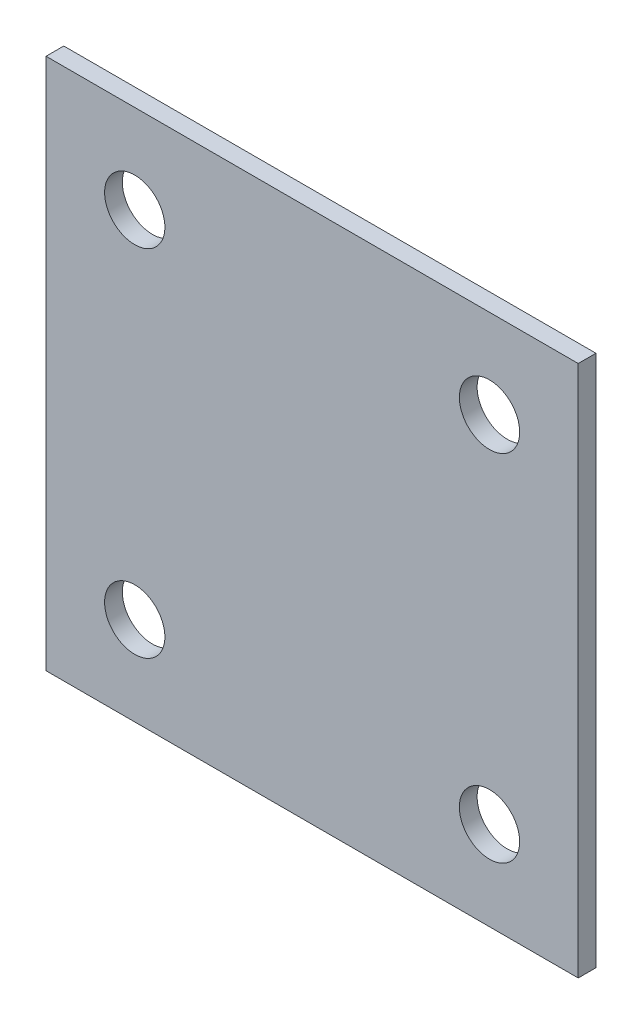
ISO-10303-21;
HEADER;
FILE_DESCRIPTION(('STEP AP214'),'2;1');
FILE_NAME('part.step','',(''),(''),'','','');
FILE_SCHEMA(('AUTOMOTIVE_DESIGN { 1 0 10303 214 1 1 1 1 }'));
ENDSEC;
DATA;
#1=APPLICATION_CONTEXT('core data for automotive mechanical design processes');
#2=APPLICATION_PROTOCOL_DEFINITION('international standard','automotive_design',2000,#1);
#3=PRODUCT_CONTEXT('',#1,'mechanical');
#4=PRODUCT('Part','Part','',(#3));
#5=PRODUCT_RELATED_PRODUCT_CATEGORY('part','',(#4));
#6=PRODUCT_DEFINITION_FORMATION('','',#4);
#7=PRODUCT_DEFINITION_CONTEXT('part definition',#1,'design');
#8=PRODUCT_DEFINITION('design','',#6,#7);
#9=PRODUCT_DEFINITION_SHAPE('','',#8);
#10=(LENGTH_UNIT() NAMED_UNIT(*) SI_UNIT(.MILLI.,.METRE.));
#11=(NAMED_UNIT(*) PLANE_ANGLE_UNIT() SI_UNIT($,.RADIAN.));
#12=(NAMED_UNIT(*) SI_UNIT($,.STERADIAN.) SOLID_ANGLE_UNIT());
#13=UNCERTAINTY_MEASURE_WITH_UNIT(LENGTH_MEASURE(1.E-05),#10,'distance_accuracy_value','');
#14=(GEOMETRIC_REPRESENTATION_CONTEXT(3) GLOBAL_UNCERTAINTY_ASSIGNED_CONTEXT((#13)) GLOBAL_UNIT_ASSIGNED_CONTEXT((#10,
#11,#12)) REPRESENTATION_CONTEXT('',''));
#15=CARTESIAN_POINT('',(0.,0.,0.));
#16=DIRECTION('',(0.,0.,1.));
#17=DIRECTION('',(1.,0.,0.));
#18=AXIS2_PLACEMENT_3D('',#15,#16,#17);
#19=CARTESIAN_POINT('',(-15.,-15.,1.));
#20=DIRECTION('',(1.,0.,0.));
#21=DIRECTION('',(0.,0.,-1.));
#22=AXIS2_PLACEMENT_3D('',#19,#20,#21);
#23=PLANE('',#22);
#24=DIRECTION('',(0.,-1.,0.));
#25=VECTOR('',#24,1.);
#26=CARTESIAN_POINT('',(-15.,-15.,0.));
#27=LINE('',#26,#25);
#28=CARTESIAN_POINT('',(-15.,15.,0.));
#29=VERTEX_POINT('',#28);
#30=CARTESIAN_POINT('',(-15.,-15.,0.));
#31=VERTEX_POINT('',#30);
#32=EDGE_CURVE('E95',#29,#31,#27,.T.);
#33=ORIENTED_EDGE('',*,*,#32,.T.);
#34=DIRECTION('',(0.,0.,-1.));
#35=VECTOR('',#34,1.);
#36=CARTESIAN_POINT('',(-15.,-15.,1.));
#37=LINE('',#36,#35);
#38=CARTESIAN_POINT('',(-15.,-15.,1.));
#39=VERTEX_POINT('',#38);
#40=EDGE_CURVE('E11',#39,#31,#37,.T.);
#41=ORIENTED_EDGE('',*,*,#40,.F.);
#42=DIRECTION('',(0.,-1.,0.));
#43=VECTOR('',#42,1.);
#44=CARTESIAN_POINT('',(-15.,-15.,1.));
#45=LINE('',#44,#43);
#46=CARTESIAN_POINT('',(-15.,15.,1.));
#47=VERTEX_POINT('',#46);
#48=EDGE_CURVE('E83',#47,#39,#45,.T.);
#49=ORIENTED_EDGE('',*,*,#48,.F.);
#50=DIRECTION('',(0.,0.,-1.));
#51=VECTOR('',#50,1.);
#52=CARTESIAN_POINT('',(-15.,15.,1.));
#53=LINE('',#52,#51);
#54=EDGE_CURVE('E91',#47,#29,#53,.T.);
#55=ORIENTED_EDGE('',*,*,#54,.T.);
#56=EDGE_LOOP('',(#33,#41,#49,#55));
#57=FACE_BOUND('',#56,.T.);
#58=ADVANCED_FACE('F32',(#57),#23,.F.);
#59=CARTESIAN_POINT('',(15.,-15.,1.));
#60=DIRECTION('',(0.,1.,0.));
#61=DIRECTION('',(-1.,0.,0.));
#62=AXIS2_PLACEMENT_3D('',#59,#60,#61);
#63=PLANE('',#62);
#64=DIRECTION('',(1.,0.,0.));
#65=VECTOR('',#64,1.);
#66=CARTESIAN_POINT('',(15.,-15.,0.));
#67=LINE('',#66,#65);
#68=CARTESIAN_POINT('',(15.,-15.,0.));
#69=VERTEX_POINT('',#68);
#70=EDGE_CURVE('E87',#31,#69,#67,.T.);
#71=ORIENTED_EDGE('',*,*,#70,.T.);
#72=DIRECTION('',(0.,0.,-1.));
#73=VECTOR('',#72,1.);
#74=CARTESIAN_POINT('',(15.,-15.,1.));
#75=LINE('',#74,#73);
#76=CARTESIAN_POINT('',(15.,-15.,1.));
#77=VERTEX_POINT('',#76);
#78=EDGE_CURVE('E40',#77,#69,#75,.T.);
#79=ORIENTED_EDGE('',*,*,#78,.F.);
#80=DIRECTION('',(1.,0.,0.));
#81=VECTOR('',#80,1.);
#82=CARTESIAN_POINT('',(15.,-15.,1.));
#83=LINE('',#82,#81);
#84=EDGE_CURVE('E78',#39,#77,#83,.T.);
#85=ORIENTED_EDGE('',*,*,#84,.F.);
#86=ORIENTED_EDGE('',*,*,#40,.T.);
#87=EDGE_LOOP('',(#71,#79,#85,#86));
#88=FACE_BOUND('',#87,.T.);
#89=ADVANCED_FACE('F86',(#88),#63,.F.);
#90=CARTESIAN_POINT('',(15.,-15.,1.));
#91=DIRECTION('',(-1.,0.,0.));
#92=DIRECTION('',(0.,0.,1.));
#93=AXIS2_PLACEMENT_3D('',#90,#91,#92);
#94=PLANE('',#93);
#95=DIRECTION('',(0.,1.,0.));
#96=VECTOR('',#95,1.);
#97=CARTESIAN_POINT('',(15.,-15.,0.));
#98=LINE('',#97,#96);
#99=CARTESIAN_POINT('',(15.,15.,0.));
#100=VERTEX_POINT('',#99);
#101=EDGE_CURVE('E65',#69,#100,#98,.T.);
#102=ORIENTED_EDGE('',*,*,#101,.T.);
#103=DIRECTION('',(0.,0.,-1.));
#104=VECTOR('',#103,1.);
#105=CARTESIAN_POINT('',(15.,15.,1.));
#106=LINE('',#105,#104);
#107=CARTESIAN_POINT('',(15.,15.,1.));
#108=VERTEX_POINT('',#107);
#109=EDGE_CURVE('E88',#108,#100,#106,.T.);
#110=ORIENTED_EDGE('',*,*,#109,.F.);
#111=DIRECTION('',(0.,1.,0.));
#112=VECTOR('',#111,1.);
#113=CARTESIAN_POINT('',(15.,-15.,1.));
#114=LINE('',#113,#112);
#115=EDGE_CURVE('E81',#77,#108,#114,.T.);
#116=ORIENTED_EDGE('',*,*,#115,.F.);
#117=ORIENTED_EDGE('',*,*,#78,.T.);
#118=EDGE_LOOP('',(#102,#110,#116,#117));
#119=FACE_BOUND('',#118,.T.);
#120=ADVANCED_FACE('F89',(#119),#94,.F.);
#121=CARTESIAN_POINT('',(15.,15.,1.));
#122=DIRECTION('',(0.,-1.,0.));
#123=DIRECTION('',(1.,0.,0.));
#124=AXIS2_PLACEMENT_3D('',#121,#122,#123);
#125=PLANE('',#124);
#126=DIRECTION('',(-1.,0.,0.));
#127=VECTOR('',#126,1.);
#128=CARTESIAN_POINT('',(15.,15.,0.));
#129=LINE('',#128,#127);
#130=EDGE_CURVE('E71',#100,#29,#129,.T.);
#131=ORIENTED_EDGE('',*,*,#130,.T.);
#132=ORIENTED_EDGE('',*,*,#54,.F.);
#133=DIRECTION('',(-1.,0.,0.));
#134=VECTOR('',#133,1.);
#135=CARTESIAN_POINT('',(15.,15.,1.));
#136=LINE('',#135,#134);
#137=EDGE_CURVE('E48',#108,#47,#136,.T.);
#138=ORIENTED_EDGE('',*,*,#137,.F.);
#139=ORIENTED_EDGE('',*,*,#109,.T.);
#140=EDGE_LOOP('',(#131,#132,#138,#139));
#141=FACE_BOUND('',#140,.T.);
#142=ADVANCED_FACE('F103',(#141),#125,.F.);
#143=CARTESIAN_POINT('',(0.,0.,1.));
#144=DIRECTION('',(0.,0.,1.));
#145=DIRECTION('',(1.,0.,0.));
#146=AXIS2_PLACEMENT_3D('',#143,#144,#145);
#147=PLANE('',#146);
#148=CARTESIAN_POINT('',(-10.,-10.,1.));
#149=DIRECTION('',(0.,0.,-1.));
#150=DIRECTION('',(-1.,0.,0.));
#151=AXIS2_PLACEMENT_3D('',#148,#149,#150);
#152=CIRCLE('',#151,1.7);
#153=CARTESIAN_POINT('',(-11.7,-10.,1.));
#154=VERTEX_POINT('',#153);
#155=EDGE_CURVE('E126',#154,#154,#152,.T.);
#156=ORIENTED_EDGE('',*,*,#155,.T.);
#157=EDGE_LOOP('',(#156));
#158=FACE_BOUND('',#157,.T.);
#159=CARTESIAN_POINT('',(-9.99999999999999,10.,1.));
#160=DIRECTION('',(0.,0.,-1.));
#161=DIRECTION('',(-1.,0.,0.));
#162=AXIS2_PLACEMENT_3D('',#159,#160,#161);
#163=CIRCLE('',#162,1.7);
#164=CARTESIAN_POINT('',(-11.7,10.,1.));
#165=VERTEX_POINT('',#164);
#166=EDGE_CURVE('E120',#165,#165,#163,.T.);
#167=ORIENTED_EDGE('',*,*,#166,.T.);
#168=EDGE_LOOP('',(#167));
#169=FACE_BOUND('',#168,.T.);
#170=CARTESIAN_POINT('',(10.,10.,1.));
#171=DIRECTION('',(0.,0.,-1.));
#172=DIRECTION('',(-1.,0.,0.));
#173=AXIS2_PLACEMENT_3D('',#170,#171,#172);
#174=CIRCLE('',#173,1.7);
#175=CARTESIAN_POINT('',(8.30000000000001,10.,1.));
#176=VERTEX_POINT('',#175);
#177=EDGE_CURVE('E114',#176,#176,#174,.T.);
#178=ORIENTED_EDGE('',*,*,#177,.T.);
#179=EDGE_LOOP('',(#178));
#180=FACE_BOUND('',#179,.T.);
#181=CARTESIAN_POINT('',(10.,-10.,1.));
#182=DIRECTION('',(0.,0.,-1.));
#183=DIRECTION('',(-1.,0.,0.));
#184=AXIS2_PLACEMENT_3D('',#181,#182,#183);
#185=CIRCLE('',#184,1.7);
#186=CARTESIAN_POINT('',(8.30000000000001,-10.,1.));
#187=VERTEX_POINT('',#186);
#188=EDGE_CURVE('E98',#187,#187,#185,.T.);
#189=ORIENTED_EDGE('',*,*,#188,.T.);
#190=EDGE_LOOP('',(#189));
#191=FACE_BOUND('',#190,.T.);
#192=ORIENTED_EDGE('',*,*,#48,.T.);
#193=ORIENTED_EDGE('',*,*,#84,.T.);
#194=ORIENTED_EDGE('',*,*,#115,.T.);
#195=ORIENTED_EDGE('',*,*,#137,.T.);
#196=EDGE_LOOP('',(#192,#193,#194,#195));
#197=FACE_BOUND('',#196,.T.);
#198=ADVANCED_FACE('F79',(#158,#169,#180,#191,#197),#147,.T.);
#199=CARTESIAN_POINT('',(0.,0.,0.));
#200=DIRECTION('',(0.,0.,1.));
#201=DIRECTION('',(1.,0.,0.));
#202=AXIS2_PLACEMENT_3D('',#199,#200,#201);
#203=PLANE('',#202);
#204=CARTESIAN_POINT('',(-10.,-10.,0.));
#205=DIRECTION('',(0.,0.,-1.));
#206=DIRECTION('',(-1.,0.,0.));
#207=AXIS2_PLACEMENT_3D('',#204,#205,#206);
#208=CIRCLE('',#207,1.7);
#209=CARTESIAN_POINT('',(-11.7,-10.,0.));
#210=VERTEX_POINT('',#209);
#211=EDGE_CURVE('E129',#210,#210,#208,.T.);
#212=ORIENTED_EDGE('',*,*,#211,.F.);
#213=EDGE_LOOP('',(#212));
#214=FACE_BOUND('',#213,.T.);
#215=CARTESIAN_POINT('',(-9.99999999999999,10.,0.));
#216=DIRECTION('',(0.,0.,-1.));
#217=DIRECTION('',(-1.,0.,0.));
#218=AXIS2_PLACEMENT_3D('',#215,#216,#217);
#219=CIRCLE('',#218,1.7);
#220=CARTESIAN_POINT('',(-11.7,10.,0.));
#221=VERTEX_POINT('',#220);
#222=EDGE_CURVE('E123',#221,#221,#219,.T.);
#223=ORIENTED_EDGE('',*,*,#222,.F.);
#224=EDGE_LOOP('',(#223));
#225=FACE_BOUND('',#224,.T.);
#226=CARTESIAN_POINT('',(10.,10.,0.));
#227=DIRECTION('',(0.,0.,-1.));
#228=DIRECTION('',(-1.,0.,0.));
#229=AXIS2_PLACEMENT_3D('',#226,#227,#228);
#230=CIRCLE('',#229,1.7);
#231=CARTESIAN_POINT('',(8.3,10.,0.));
#232=VERTEX_POINT('',#231);
#233=EDGE_CURVE('E117',#232,#232,#230,.T.);
#234=ORIENTED_EDGE('',*,*,#233,.F.);
#235=EDGE_LOOP('',(#234));
#236=FACE_BOUND('',#235,.T.);
#237=CARTESIAN_POINT('',(10.,-10.,0.));
#238=DIRECTION('',(0.,0.,-1.));
#239=DIRECTION('',(-1.,0.,0.));
#240=AXIS2_PLACEMENT_3D('',#237,#238,#239);
#241=CIRCLE('',#240,1.7);
#242=CARTESIAN_POINT('',(8.3,-10.,0.));
#243=VERTEX_POINT('',#242);
#244=EDGE_CURVE('E111',#243,#243,#241,.T.);
#245=ORIENTED_EDGE('',*,*,#244,.F.);
#246=EDGE_LOOP('',(#245));
#247=FACE_BOUND('',#246,.T.);
#248=ORIENTED_EDGE('',*,*,#32,.F.);
#249=ORIENTED_EDGE('',*,*,#130,.F.);
#250=ORIENTED_EDGE('',*,*,#101,.F.);
#251=ORIENTED_EDGE('',*,*,#70,.F.);
#252=EDGE_LOOP('',(#248,#249,#250,#251));
#253=FACE_BOUND('',#252,.T.);
#254=ADVANCED_FACE('F106',(#214,#225,#236,#247,#253),#203,.F.);
#255=CARTESIAN_POINT('',(10.,-10.,0.));
#256=DIRECTION('',(0.,0.,-1.));
#257=DIRECTION('',(-1.,0.,0.));
#258=AXIS2_PLACEMENT_3D('',#255,#256,#257);
#259=CYLINDRICAL_SURFACE('',#258,1.7);
#260=ORIENTED_EDGE('',*,*,#188,.F.);
#261=EDGE_LOOP('',(#260));
#262=FACE_BOUND('',#261,.T.);
#263=ORIENTED_EDGE('',*,*,#244,.T.);
#264=EDGE_LOOP('',(#263));
#265=FACE_BOUND('',#264,.T.);
#266=ADVANCED_FACE('F137',(#262,#265),#259,.F.);
#267=CARTESIAN_POINT('',(10.,10.,0.));
#268=DIRECTION('',(0.,0.,-1.));
#269=DIRECTION('',(-1.,0.,0.));
#270=AXIS2_PLACEMENT_3D('',#267,#268,#269);
#271=CYLINDRICAL_SURFACE('',#270,1.7);
#272=ORIENTED_EDGE('',*,*,#177,.F.);
#273=EDGE_LOOP('',(#272));
#274=FACE_BOUND('',#273,.T.);
#275=ORIENTED_EDGE('',*,*,#233,.T.);
#276=EDGE_LOOP('',(#275));
#277=FACE_BOUND('',#276,.T.);
#278=ADVANCED_FACE('F146',(#274,#277),#271,.F.);
#279=CARTESIAN_POINT('',(-9.99999999999999,10.,0.));
#280=DIRECTION('',(0.,0.,-1.));
#281=DIRECTION('',(-1.,0.,0.));
#282=AXIS2_PLACEMENT_3D('',#279,#280,#281);
#283=CYLINDRICAL_SURFACE('',#282,1.7);
#284=ORIENTED_EDGE('',*,*,#166,.F.);
#285=EDGE_LOOP('',(#284));
#286=FACE_BOUND('',#285,.T.);
#287=ORIENTED_EDGE('',*,*,#222,.T.);
#288=EDGE_LOOP('',(#287));
#289=FACE_BOUND('',#288,.T.);
#290=ADVANCED_FACE('F152',(#286,#289),#283,.F.);
#291=CARTESIAN_POINT('',(-10.,-10.,0.));
#292=DIRECTION('',(0.,0.,-1.));
#293=DIRECTION('',(-1.,0.,0.));
#294=AXIS2_PLACEMENT_3D('',#291,#292,#293);
#295=CYLINDRICAL_SURFACE('',#294,1.7);
#296=ORIENTED_EDGE('',*,*,#155,.F.);
#297=EDGE_LOOP('',(#296));
#298=FACE_BOUND('',#297,.T.);
#299=ORIENTED_EDGE('',*,*,#211,.T.);
#300=EDGE_LOOP('',(#299));
#301=FACE_BOUND('',#300,.T.);
#302=ADVANCED_FACE('F133',(#298,#301),#295,.F.);
#303=CLOSED_SHELL('',(#58,#89,#120,#142,#198,#254,#266,#278,#290,#302));
#304=MANIFOLD_SOLID_BREP('B2',#303);
#305=ADVANCED_BREP_SHAPE_REPRESENTATION('',(#18,#304),#14);
#306=SHAPE_DEFINITION_REPRESENTATION(#9,#305);
ENDSEC;
END-ISO-10303-21;
